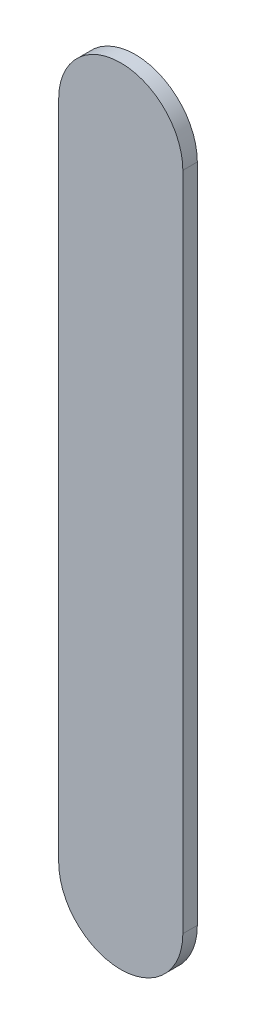
ISO-10303-21;
HEADER;
FILE_DESCRIPTION(('STEP AP214'),'2;1');
FILE_NAME('part.step','',(''),(''),'','','');
FILE_SCHEMA(('AUTOMOTIVE_DESIGN { 1 0 10303 214 1 1 1 1 }'));
ENDSEC;
DATA;
#1=APPLICATION_CONTEXT('core data for automotive mechanical design processes');
#2=APPLICATION_PROTOCOL_DEFINITION('international standard','automotive_design',2000,#1);
#3=PRODUCT_CONTEXT('',#1,'mechanical');
#4=PRODUCT('Part','Part','',(#3));
#5=PRODUCT_RELATED_PRODUCT_CATEGORY('part','',(#4));
#6=PRODUCT_DEFINITION_FORMATION('','',#4);
#7=PRODUCT_DEFINITION_CONTEXT('part definition',#1,'design');
#8=PRODUCT_DEFINITION('design','',#6,#7);
#9=PRODUCT_DEFINITION_SHAPE('','',#8);
#10=(LENGTH_UNIT() NAMED_UNIT(*) SI_UNIT(.MILLI.,.METRE.));
#11=(NAMED_UNIT(*) PLANE_ANGLE_UNIT() SI_UNIT($,.RADIAN.));
#12=(NAMED_UNIT(*) SI_UNIT($,.STERADIAN.) SOLID_ANGLE_UNIT());
#13=UNCERTAINTY_MEASURE_WITH_UNIT(LENGTH_MEASURE(1.E-05),#10,'distance_accuracy_value','');
#14=(GEOMETRIC_REPRESENTATION_CONTEXT(3) GLOBAL_UNCERTAINTY_ASSIGNED_CONTEXT((#13)) GLOBAL_UNIT_ASSIGNED_CONTEXT((#10,
#11,#12)) REPRESENTATION_CONTEXT('',''));
#15=CARTESIAN_POINT('',(0.,0.,0.));
#16=DIRECTION('',(0.,0.,1.));
#17=DIRECTION('',(1.,0.,0.));
#18=AXIS2_PLACEMENT_3D('',#15,#16,#17);
#19=CARTESIAN_POINT('',(126.35,-69.9125,1.635));
#20=DIRECTION('',(0.,0.,1.));
#21=DIRECTION('',(1.,0.,0.));
#22=AXIS2_PLACEMENT_3D('',#19,#20,#21);
#23=PLANE('',#22);
#24=DIRECTION('',(0.,-1.,0.));
#25=VECTOR('',#24,1.);
#26=CARTESIAN_POINT('',(126.35,-69.9125,1.635));
#27=LINE('',#26,#25);
#28=CARTESIAN_POINT('',(126.35,-69.9125,1.635));
#29=VERTEX_POINT('',#28);
#30=CARTESIAN_POINT('',(126.35,-71.51,1.635));
#31=VERTEX_POINT('',#30);
#32=EDGE_CURVE('E78',#29,#31,#27,.T.);
#33=ORIENTED_EDGE('',*,*,#32,.T.);
#34=CARTESIAN_POINT('',(126.5,-71.51,1.635));
#35=DIRECTION('',(0.,0.,1.));
#36=DIRECTION('',(-1.,0.,0.));
#37=AXIS2_PLACEMENT_3D('',#34,#35,#36);
#38=CIRCLE('',#37,0.15);
#39=CARTESIAN_POINT('',(126.65,-71.51,1.635));
#40=VERTEX_POINT('',#39);
#41=EDGE_CURVE('E76',#31,#40,#38,.T.);
#42=ORIENTED_EDGE('',*,*,#41,.T.);
#43=DIRECTION('',(0.,1.,0.));
#44=VECTOR('',#43,1.);
#45=CARTESIAN_POINT('',(126.65,-71.51,1.635));
#46=LINE('',#45,#44);
#47=CARTESIAN_POINT('',(126.65,-69.9125,1.635));
#48=VERTEX_POINT('',#47);
#49=EDGE_CURVE('E65',#40,#48,#46,.T.);
#50=ORIENTED_EDGE('',*,*,#49,.T.);
#51=CARTESIAN_POINT('',(126.5,-69.9125,1.635));
#52=DIRECTION('',(0.,0.,1.));
#53=DIRECTION('',(1.,0.,0.));
#54=AXIS2_PLACEMENT_3D('',#51,#52,#53);
#55=CIRCLE('',#54,0.15);
#56=EDGE_CURVE('E11',#48,#29,#55,.T.);
#57=ORIENTED_EDGE('',*,*,#56,.T.);
#58=EDGE_LOOP('',(#33,#42,#50,#57));
#59=FACE_BOUND('',#58,.T.);
#60=ADVANCED_FACE('F17',(#59),#23,.T.);
#61=CARTESIAN_POINT('',(126.35,-69.9125,1.6));
#62=DIRECTION('',(0.,0.,1.));
#63=DIRECTION('',(1.,0.,0.));
#64=AXIS2_PLACEMENT_3D('',#61,#62,#63);
#65=PLANE('',#64);
#66=CARTESIAN_POINT('',(126.5,-69.9125,1.6));
#67=DIRECTION('',(0.,0.,1.));
#68=DIRECTION('',(1.,0.,0.));
#69=AXIS2_PLACEMENT_3D('',#66,#67,#68);
#70=CIRCLE('',#69,0.15);
#71=CARTESIAN_POINT('',(126.65,-69.9125,1.6));
#72=VERTEX_POINT('',#71);
#73=CARTESIAN_POINT('',(126.35,-69.9125,1.6));
#74=VERTEX_POINT('',#73);
#75=EDGE_CURVE('E26',#72,#74,#70,.T.);
#76=ORIENTED_EDGE('',*,*,#75,.F.);
#77=DIRECTION('',(0.,1.,0.));
#78=VECTOR('',#77,1.);
#79=CARTESIAN_POINT('',(126.65,-71.51,1.6));
#80=LINE('',#79,#78);
#81=CARTESIAN_POINT('',(126.65,-71.51,1.6));
#82=VERTEX_POINT('',#81);
#83=EDGE_CURVE('E83',#82,#72,#80,.T.);
#84=ORIENTED_EDGE('',*,*,#83,.F.);
#85=CARTESIAN_POINT('',(126.5,-71.51,1.6));
#86=DIRECTION('',(0.,0.,1.));
#87=DIRECTION('',(-1.,0.,0.));
#88=AXIS2_PLACEMENT_3D('',#85,#86,#87);
#89=CIRCLE('',#88,0.15);
#90=CARTESIAN_POINT('',(126.35,-71.51,1.6));
#91=VERTEX_POINT('',#90);
#92=EDGE_CURVE('E86',#91,#82,#89,.T.);
#93=ORIENTED_EDGE('',*,*,#92,.F.);
#94=DIRECTION('',(0.,-1.,0.));
#95=VECTOR('',#94,1.);
#96=CARTESIAN_POINT('',(126.35,-69.9125,1.6));
#97=LINE('',#96,#95);
#98=EDGE_CURVE('E115',#74,#91,#97,.T.);
#99=ORIENTED_EDGE('',*,*,#98,.F.);
#100=EDGE_LOOP('',(#76,#84,#93,#99));
#101=FACE_BOUND('',#100,.T.);
#102=ADVANCED_FACE('F126',(#101),#65,.F.);
#103=CARTESIAN_POINT('',(126.5,-69.9125,1.6));
#104=DIRECTION('',(0.,0.,-1.));
#105=DIRECTION('',(1.,0.,0.));
#106=AXIS2_PLACEMENT_3D('',#103,#104,#105);
#107=CYLINDRICAL_SURFACE('',#106,0.15);
#108=ORIENTED_EDGE('',*,*,#75,.T.);
#109=DIRECTION('',(0.,0.,1.));
#110=VECTOR('',#109,1.);
#111=CARTESIAN_POINT('',(126.35,-69.9125,1.6));
#112=LINE('',#111,#110);
#113=EDGE_CURVE('E93',#74,#29,#112,.T.);
#114=ORIENTED_EDGE('',*,*,#113,.T.);
#115=ORIENTED_EDGE('',*,*,#56,.F.);
#116=DIRECTION('',(0.,0.,1.));
#117=VECTOR('',#116,1.);
#118=CARTESIAN_POINT('',(126.65,-69.9125,1.6));
#119=LINE('',#118,#117);
#120=EDGE_CURVE('E72',#72,#48,#119,.T.);
#121=ORIENTED_EDGE('',*,*,#120,.F.);
#122=EDGE_LOOP('',(#108,#114,#115,#121));
#123=FACE_BOUND('',#122,.T.);
#124=ADVANCED_FACE('F128',(#123),#107,.T.);
#125=CARTESIAN_POINT('',(126.65,-71.51,1.6));
#126=DIRECTION('',(-1.,0.,0.));
#127=DIRECTION('',(0.,0.,1.));
#128=AXIS2_PLACEMENT_3D('',#125,#126,#127);
#129=PLANE('',#128);
#130=ORIENTED_EDGE('',*,*,#83,.T.);
#131=ORIENTED_EDGE('',*,*,#120,.T.);
#132=ORIENTED_EDGE('',*,*,#49,.F.);
#133=DIRECTION('',(0.,0.,1.));
#134=VECTOR('',#133,1.);
#135=CARTESIAN_POINT('',(126.65,-71.51,1.6));
#136=LINE('',#135,#134);
#137=EDGE_CURVE('E70',#82,#40,#136,.T.);
#138=ORIENTED_EDGE('',*,*,#137,.F.);
#139=EDGE_LOOP('',(#130,#131,#132,#138));
#140=FACE_BOUND('',#139,.T.);
#141=ADVANCED_FACE('F68',(#140),#129,.F.);
#142=CARTESIAN_POINT('',(126.5,-71.51,1.6));
#143=DIRECTION('',(0.,0.,-1.));
#144=DIRECTION('',(-1.,0.,0.));
#145=AXIS2_PLACEMENT_3D('',#142,#143,#144);
#146=CYLINDRICAL_SURFACE('',#145,0.15);
#147=ORIENTED_EDGE('',*,*,#92,.T.);
#148=ORIENTED_EDGE('',*,*,#137,.T.);
#149=ORIENTED_EDGE('',*,*,#41,.F.);
#150=DIRECTION('',(0.,0.,1.));
#151=VECTOR('',#150,1.);
#152=CARTESIAN_POINT('',(126.35,-71.51,1.6));
#153=LINE('',#152,#151);
#154=EDGE_CURVE('E111',#91,#31,#153,.T.);
#155=ORIENTED_EDGE('',*,*,#154,.F.);
#156=EDGE_LOOP('',(#147,#148,#149,#155));
#157=FACE_BOUND('',#156,.T.);
#158=ADVANCED_FACE('F85',(#157),#146,.T.);
#159=CARTESIAN_POINT('',(126.35,-69.9125,1.6));
#160=DIRECTION('',(1.,0.,0.));
#161=DIRECTION('',(0.,1.,0.));
#162=AXIS2_PLACEMENT_3D('',#159,#160,#161);
#163=PLANE('',#162);
#164=ORIENTED_EDGE('',*,*,#98,.T.);
#165=ORIENTED_EDGE('',*,*,#154,.T.);
#166=ORIENTED_EDGE('',*,*,#32,.F.);
#167=ORIENTED_EDGE('',*,*,#113,.F.);
#168=EDGE_LOOP('',(#164,#165,#166,#167));
#169=FACE_BOUND('',#168,.T.);
#170=ADVANCED_FACE('F124',(#169),#163,.F.);
#171=CLOSED_SHELL('',(#60,#102,#124,#141,#158,#170));
#172=MANIFOLD_SOLID_BREP('B1',#171);
#173=ADVANCED_BREP_SHAPE_REPRESENTATION('',(#18,#172),#14);
#174=SHAPE_DEFINITION_REPRESENTATION(#9,#173);
ENDSEC;
END-ISO-10303-21;
